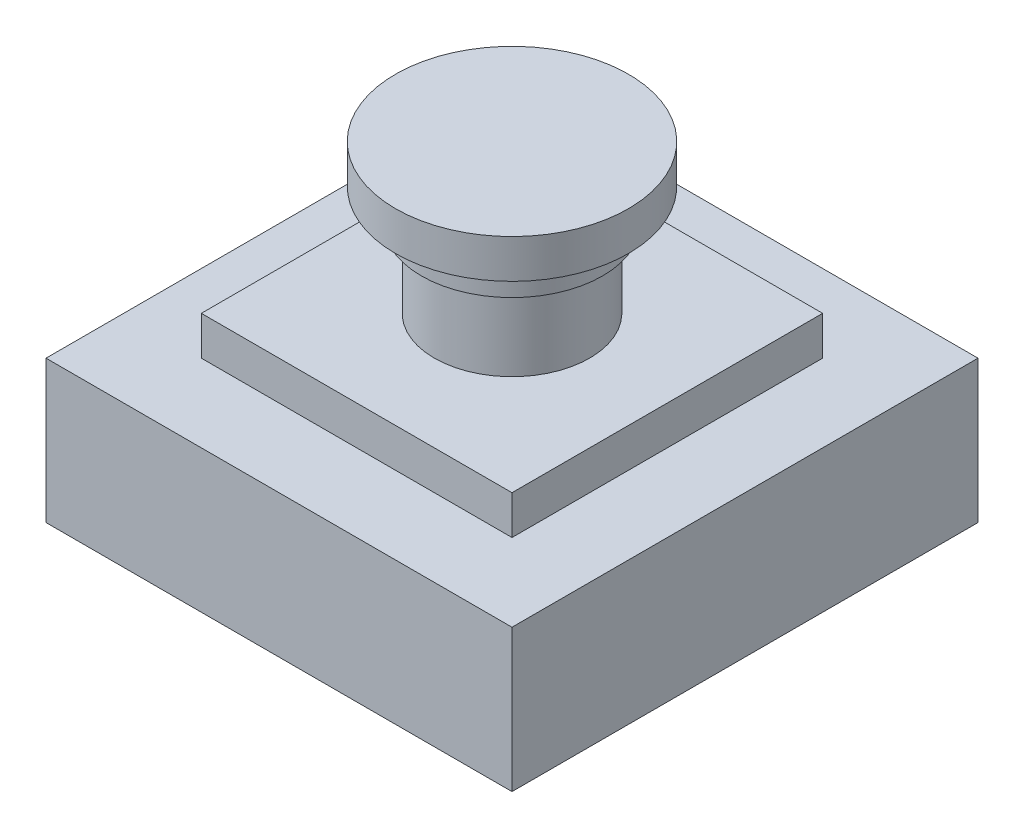
ISO-10303-21;
HEADER;
FILE_DESCRIPTION(('STEP AP214'),'2;1');
FILE_NAME('part.step','',(''),(''),'','','');
FILE_SCHEMA(('AUTOMOTIVE_DESIGN { 1 0 10303 214 1 1 1 1 }'));
ENDSEC;
DATA;
#1=APPLICATION_CONTEXT('core data for automotive mechanical design processes');
#2=APPLICATION_PROTOCOL_DEFINITION('international standard','automotive_design',2000,#1);
#3=PRODUCT_CONTEXT('',#1,'mechanical');
#4=PRODUCT('Part','Part','',(#3));
#5=PRODUCT_RELATED_PRODUCT_CATEGORY('part','',(#4));
#6=PRODUCT_DEFINITION_FORMATION('','',#4);
#7=PRODUCT_DEFINITION_CONTEXT('part definition',#1,'design');
#8=PRODUCT_DEFINITION('design','',#6,#7);
#9=PRODUCT_DEFINITION_SHAPE('','',#8);
#10=(LENGTH_UNIT() NAMED_UNIT(*) SI_UNIT(.MILLI.,.METRE.));
#11=(NAMED_UNIT(*) PLANE_ANGLE_UNIT() SI_UNIT($,.RADIAN.));
#12=(NAMED_UNIT(*) SI_UNIT($,.STERADIAN.) SOLID_ANGLE_UNIT());
#13=UNCERTAINTY_MEASURE_WITH_UNIT(LENGTH_MEASURE(1.E-05),#10,'distance_accuracy_value','');
#14=(GEOMETRIC_REPRESENTATION_CONTEXT(3) GLOBAL_UNCERTAINTY_ASSIGNED_CONTEXT((#13)) GLOBAL_UNIT_ASSIGNED_CONTEXT((#10,
#11,#12)) REPRESENTATION_CONTEXT('',''));
#15=CARTESIAN_POINT('',(0.,0.,0.));
#16=DIRECTION('',(0.,0.,1.));
#17=DIRECTION('',(1.,0.,0.));
#18=AXIS2_PLACEMENT_3D('',#15,#16,#17);
#19=CARTESIAN_POINT('',(18.,11.,-18.));
#20=DIRECTION('',(-1.,0.,0.));
#21=DIRECTION('',(0.,0.,1.));
#22=AXIS2_PLACEMENT_3D('',#19,#20,#21);
#23=PLANE('',#22);
#24=DIRECTION('',(0.,0.,-1.));
#25=VECTOR('',#24,1.);
#26=CARTESIAN_POINT('',(18.,0.,-18.));
#27=LINE('',#26,#25);
#28=CARTESIAN_POINT('',(18.,0.,18.));
#29=VERTEX_POINT('',#28);
#30=CARTESIAN_POINT('',(18.,0.,-18.));
#31=VERTEX_POINT('',#30);
#32=EDGE_CURVE('E118',#29,#31,#27,.T.);
#33=ORIENTED_EDGE('',*,*,#32,.T.);
#34=DIRECTION('',(0.,-1.,0.));
#35=VECTOR('',#34,1.);
#36=CARTESIAN_POINT('',(18.,11.,-18.));
#37=LINE('',#36,#35);
#38=CARTESIAN_POINT('',(18.,11.,-18.));
#39=VERTEX_POINT('',#38);
#40=EDGE_CURVE('E36',#39,#31,#37,.T.);
#41=ORIENTED_EDGE('',*,*,#40,.F.);
#42=DIRECTION('',(0.,0.,-1.));
#43=VECTOR('',#42,1.);
#44=CARTESIAN_POINT('',(18.,11.,-18.));
#45=LINE('',#44,#43);
#46=CARTESIAN_POINT('',(18.,11.,18.));
#47=VERTEX_POINT('',#46);
#48=EDGE_CURVE('E127',#47,#39,#45,.T.);
#49=ORIENTED_EDGE('',*,*,#48,.F.);
#50=DIRECTION('',(0.,-1.,0.));
#51=VECTOR('',#50,1.);
#52=CARTESIAN_POINT('',(18.,11.,18.));
#53=LINE('',#52,#51);
#54=EDGE_CURVE('E136',#47,#29,#53,.T.);
#55=ORIENTED_EDGE('',*,*,#54,.T.);
#56=EDGE_LOOP('',(#33,#41,#49,#55));
#57=FACE_BOUND('',#56,.T.);
#58=ADVANCED_FACE('F33',(#57),#23,.F.);
#59=CARTESIAN_POINT('',(-18.,11.,-18.));
#60=DIRECTION('',(0.,0.,1.));
#61=DIRECTION('',(1.,0.,0.));
#62=AXIS2_PLACEMENT_3D('',#59,#60,#61);
#63=PLANE('',#62);
#64=DIRECTION('',(-1.,0.,0.));
#65=VECTOR('',#64,1.);
#66=CARTESIAN_POINT('',(-18.,0.,-18.));
#67=LINE('',#66,#65);
#68=CARTESIAN_POINT('',(-18.,0.,-18.));
#69=VERTEX_POINT('',#68);
#70=EDGE_CURVE('E121',#31,#69,#67,.T.);
#71=ORIENTED_EDGE('',*,*,#70,.T.);
#72=DIRECTION('',(0.,-1.,0.));
#73=VECTOR('',#72,1.);
#74=CARTESIAN_POINT('',(-18.,11.,-18.));
#75=LINE('',#74,#73);
#76=CARTESIAN_POINT('',(-18.,11.,-18.));
#77=VERTEX_POINT('',#76);
#78=EDGE_CURVE('E146',#77,#69,#75,.T.);
#79=ORIENTED_EDGE('',*,*,#78,.F.);
#80=DIRECTION('',(-1.,0.,0.));
#81=VECTOR('',#80,1.);
#82=CARTESIAN_POINT('',(-18.,11.,-18.));
#83=LINE('',#82,#81);
#84=EDGE_CURVE('E130',#39,#77,#83,.T.);
#85=ORIENTED_EDGE('',*,*,#84,.F.);
#86=ORIENTED_EDGE('',*,*,#40,.T.);
#87=EDGE_LOOP('',(#71,#79,#85,#86));
#88=FACE_BOUND('',#87,.T.);
#89=ADVANCED_FACE('F155',(#88),#63,.F.);
#90=CARTESIAN_POINT('',(-18.,11.,-18.));
#91=DIRECTION('',(1.,0.,0.));
#92=DIRECTION('',(0.,0.,-1.));
#93=AXIS2_PLACEMENT_3D('',#90,#91,#92);
#94=PLANE('',#93);
#95=DIRECTION('',(0.,0.,1.));
#96=VECTOR('',#95,1.);
#97=CARTESIAN_POINT('',(-18.,0.,-18.));
#98=LINE('',#97,#96);
#99=CARTESIAN_POINT('',(-18.,0.,18.));
#100=VERTEX_POINT('',#99);
#101=EDGE_CURVE('E139',#69,#100,#98,.T.);
#102=ORIENTED_EDGE('',*,*,#101,.T.);
#103=DIRECTION('',(0.,-1.,0.));
#104=VECTOR('',#103,1.);
#105=CARTESIAN_POINT('',(-18.,11.,18.));
#106=LINE('',#105,#104);
#107=CARTESIAN_POINT('',(-18.,11.,18.));
#108=VERTEX_POINT('',#107);
#109=EDGE_CURVE('E144',#108,#100,#106,.T.);
#110=ORIENTED_EDGE('',*,*,#109,.F.);
#111=DIRECTION('',(0.,0.,1.));
#112=VECTOR('',#111,1.);
#113=CARTESIAN_POINT('',(-18.,11.,-18.));
#114=LINE('',#113,#112);
#115=EDGE_CURVE('E133',#77,#108,#114,.T.);
#116=ORIENTED_EDGE('',*,*,#115,.F.);
#117=ORIENTED_EDGE('',*,*,#78,.T.);
#118=EDGE_LOOP('',(#102,#110,#116,#117));
#119=FACE_BOUND('',#118,.T.);
#120=ADVANCED_FACE('F164',(#119),#94,.F.);
#121=CARTESIAN_POINT('',(-18.,11.,18.));
#122=DIRECTION('',(0.,0.,-1.));
#123=DIRECTION('',(-1.,0.,0.));
#124=AXIS2_PLACEMENT_3D('',#121,#122,#123);
#125=PLANE('',#124);
#126=DIRECTION('',(1.,0.,0.));
#127=VECTOR('',#126,1.);
#128=CARTESIAN_POINT('',(-18.,0.,18.));
#129=LINE('',#128,#127);
#130=EDGE_CURVE('E131',#100,#29,#129,.T.);
#131=ORIENTED_EDGE('',*,*,#130,.T.);
#132=ORIENTED_EDGE('',*,*,#54,.F.);
#133=DIRECTION('',(1.,0.,0.));
#134=VECTOR('',#133,1.);
#135=CARTESIAN_POINT('',(-18.,11.,18.));
#136=LINE('',#135,#134);
#137=EDGE_CURVE('E135',#108,#47,#136,.T.);
#138=ORIENTED_EDGE('',*,*,#137,.F.);
#139=ORIENTED_EDGE('',*,*,#109,.T.);
#140=EDGE_LOOP('',(#131,#132,#138,#139));
#141=FACE_BOUND('',#140,.T.);
#142=ADVANCED_FACE('F167',(#141),#125,.F.);
#143=CARTESIAN_POINT('',(0.,11.,0.));
#144=DIRECTION('',(0.,1.,0.));
#145=DIRECTION('',(0.,0.,1.));
#146=AXIS2_PLACEMENT_3D('',#143,#144,#145);
#147=PLANE('',#146);
#148=DIRECTION('',(0.,0.,-1.));
#149=VECTOR('',#148,1.);
#150=CARTESIAN_POINT('',(12.,11.,-12.));
#151=LINE('',#150,#149);
#152=CARTESIAN_POINT('',(12.,11.,12.));
#153=VERTEX_POINT('',#152);
#154=CARTESIAN_POINT('',(12.,11.,-12.));
#155=VERTEX_POINT('',#154);
#156=EDGE_CURVE('E48',#153,#155,#151,.T.);
#157=ORIENTED_EDGE('',*,*,#156,.F.);
#158=DIRECTION('',(1.,0.,0.));
#159=VECTOR('',#158,1.);
#160=CARTESIAN_POINT('',(-12.,11.,12.));
#161=LINE('',#160,#159);
#162=CARTESIAN_POINT('',(-12.,11.,12.));
#163=VERTEX_POINT('',#162);
#164=EDGE_CURVE('E52',#163,#153,#161,.T.);
#165=ORIENTED_EDGE('',*,*,#164,.F.);
#166=DIRECTION('',(0.,0.,1.));
#167=VECTOR('',#166,1.);
#168=CARTESIAN_POINT('',(-12.,11.,-12.));
#169=LINE('',#168,#167);
#170=CARTESIAN_POINT('',(-12.,11.,-12.));
#171=VERTEX_POINT('',#170);
#172=EDGE_CURVE('E337',#171,#163,#169,.T.);
#173=ORIENTED_EDGE('',*,*,#172,.F.);
#174=DIRECTION('',(-1.,0.,0.));
#175=VECTOR('',#174,1.);
#176=CARTESIAN_POINT('',(-12.,11.,-12.));
#177=LINE('',#176,#175);
#178=EDGE_CURVE('E335',#155,#171,#177,.T.);
#179=ORIENTED_EDGE('',*,*,#178,.F.);
#180=EDGE_LOOP('',(#157,#165,#173,#179));
#181=FACE_BOUND('',#180,.T.);
#182=ORIENTED_EDGE('',*,*,#48,.T.);
#183=ORIENTED_EDGE('',*,*,#84,.T.);
#184=ORIENTED_EDGE('',*,*,#115,.T.);
#185=ORIENTED_EDGE('',*,*,#137,.T.);
#186=EDGE_LOOP('',(#182,#183,#184,#185));
#187=FACE_BOUND('',#186,.T.);
#188=ADVANCED_FACE('F169',(#181,#187),#147,.T.);
#189=CARTESIAN_POINT('',(0.,0.,0.));
#190=DIRECTION('',(0.,1.,0.));
#191=DIRECTION('',(0.,0.,1.));
#192=AXIS2_PLACEMENT_3D('',#189,#190,#191);
#193=PLANE('',#192);
#194=ORIENTED_EDGE('',*,*,#32,.F.);
#195=ORIENTED_EDGE('',*,*,#130,.F.);
#196=ORIENTED_EDGE('',*,*,#101,.F.);
#197=ORIENTED_EDGE('',*,*,#70,.F.);
#198=EDGE_LOOP('',(#194,#195,#196,#197));
#199=FACE_BOUND('',#198,.T.);
#200=ADVANCED_FACE('F162',(#199),#193,.F.);
#201=CARTESIAN_POINT('',(12.,14.,-12.));
#202=DIRECTION('',(-1.,0.,0.));
#203=DIRECTION('',(0.,0.,1.));
#204=AXIS2_PLACEMENT_3D('',#201,#202,#203);
#205=PLANE('',#204);
#206=ORIENTED_EDGE('',*,*,#156,.T.);
#207=DIRECTION('',(0.,-1.,0.));
#208=VECTOR('',#207,1.);
#209=CARTESIAN_POINT('',(12.,14.,-12.));
#210=LINE('',#209,#208);
#211=CARTESIAN_POINT('',(12.,14.,-12.));
#212=VERTEX_POINT('',#211);
#213=EDGE_CURVE('E101',#212,#155,#210,.T.);
#214=ORIENTED_EDGE('',*,*,#213,.F.);
#215=DIRECTION('',(0.,0.,-1.));
#216=VECTOR('',#215,1.);
#217=CARTESIAN_POINT('',(12.,14.,-12.));
#218=LINE('',#217,#216);
#219=CARTESIAN_POINT('',(12.,14.,12.));
#220=VERTEX_POINT('',#219);
#221=EDGE_CURVE('E107',#220,#212,#218,.T.);
#222=ORIENTED_EDGE('',*,*,#221,.F.);
#223=DIRECTION('',(0.,-1.,0.));
#224=VECTOR('',#223,1.);
#225=CARTESIAN_POINT('',(12.,14.,12.));
#226=LINE('',#225,#224);
#227=EDGE_CURVE('E333',#220,#153,#226,.T.);
#228=ORIENTED_EDGE('',*,*,#227,.T.);
#229=EDGE_LOOP('',(#206,#214,#222,#228));
#230=FACE_BOUND('',#229,.T.);
#231=ADVANCED_FACE('F117',(#230),#205,.F.);
#232=CARTESIAN_POINT('',(-12.,14.,-12.));
#233=DIRECTION('',(0.,0.,1.));
#234=DIRECTION('',(1.,0.,0.));
#235=AXIS2_PLACEMENT_3D('',#232,#233,#234);
#236=PLANE('',#235);
#237=ORIENTED_EDGE('',*,*,#178,.T.);
#238=DIRECTION('',(0.,-1.,0.));
#239=VECTOR('',#238,1.);
#240=CARTESIAN_POINT('',(-12.,14.,-12.));
#241=LINE('',#240,#239);
#242=CARTESIAN_POINT('',(-12.,14.,-12.));
#243=VERTEX_POINT('',#242);
#244=EDGE_CURVE('E103',#243,#171,#241,.T.);
#245=ORIENTED_EDGE('',*,*,#244,.F.);
#246=DIRECTION('',(-1.,0.,0.));
#247=VECTOR('',#246,1.);
#248=CARTESIAN_POINT('',(-12.,14.,-12.));
#249=LINE('',#248,#247);
#250=EDGE_CURVE('E96',#212,#243,#249,.T.);
#251=ORIENTED_EDGE('',*,*,#250,.F.);
#252=ORIENTED_EDGE('',*,*,#213,.T.);
#253=EDGE_LOOP('',(#237,#245,#251,#252));
#254=FACE_BOUND('',#253,.T.);
#255=ADVANCED_FACE('F99',(#254),#236,.F.);
#256=CARTESIAN_POINT('',(-12.,14.,-12.));
#257=DIRECTION('',(1.,0.,0.));
#258=DIRECTION('',(0.,0.,-1.));
#259=AXIS2_PLACEMENT_3D('',#256,#257,#258);
#260=PLANE('',#259);
#261=ORIENTED_EDGE('',*,*,#172,.T.);
#262=DIRECTION('',(0.,-1.,0.));
#263=VECTOR('',#262,1.);
#264=CARTESIAN_POINT('',(-12.,14.,12.));
#265=LINE('',#264,#263);
#266=CARTESIAN_POINT('',(-12.,14.,12.));
#267=VERTEX_POINT('',#266);
#268=EDGE_CURVE('E123',#267,#163,#265,.T.);
#269=ORIENTED_EDGE('',*,*,#268,.F.);
#270=DIRECTION('',(0.,0.,1.));
#271=VECTOR('',#270,1.);
#272=CARTESIAN_POINT('',(-12.,14.,-12.));
#273=LINE('',#272,#271);
#274=EDGE_CURVE('E106',#243,#267,#273,.T.);
#275=ORIENTED_EDGE('',*,*,#274,.F.);
#276=ORIENTED_EDGE('',*,*,#244,.T.);
#277=EDGE_LOOP('',(#261,#269,#275,#276));
#278=FACE_BOUND('',#277,.T.);
#279=ADVANCED_FACE('F219',(#278),#260,.F.);
#280=CARTESIAN_POINT('',(-12.,14.,12.));
#281=DIRECTION('',(0.,0.,-1.));
#282=DIRECTION('',(-1.,0.,0.));
#283=AXIS2_PLACEMENT_3D('',#280,#281,#282);
#284=PLANE('',#283);
#285=ORIENTED_EDGE('',*,*,#164,.T.);
#286=ORIENTED_EDGE('',*,*,#227,.F.);
#287=DIRECTION('',(1.,0.,0.));
#288=VECTOR('',#287,1.);
#289=CARTESIAN_POINT('',(-12.,14.,12.));
#290=LINE('',#289,#288);
#291=EDGE_CURVE('E112',#267,#220,#290,.T.);
#292=ORIENTED_EDGE('',*,*,#291,.F.);
#293=ORIENTED_EDGE('',*,*,#268,.T.);
#294=EDGE_LOOP('',(#285,#286,#292,#293));
#295=FACE_BOUND('',#294,.T.);
#296=ADVANCED_FACE('F228',(#295),#284,.F.);
#297=CARTESIAN_POINT('',(0.,14.,0.));
#298=DIRECTION('',(0.,1.,0.));
#299=DIRECTION('',(0.,0.,1.));
#300=AXIS2_PLACEMENT_3D('',#297,#298,#299);
#301=PLANE('',#300);
#302=CARTESIAN_POINT('',(0.,14.,0.));
#303=DIRECTION('',(0.,1.,0.));
#304=DIRECTION('',(0.,0.,1.));
#305=AXIS2_PLACEMENT_3D('',#302,#303,#304);
#306=CIRCLE('',#305,6.);
#307=CARTESIAN_POINT('',(0.,14.,6.));
#308=VERTEX_POINT('',#307);
#309=EDGE_CURVE('E11',#308,#308,#306,.T.);
#310=ORIENTED_EDGE('',*,*,#309,.F.);
#311=EDGE_LOOP('',(#310));
#312=FACE_BOUND('',#311,.T.);
#313=ORIENTED_EDGE('',*,*,#221,.T.);
#314=ORIENTED_EDGE('',*,*,#250,.T.);
#315=ORIENTED_EDGE('',*,*,#274,.T.);
#316=ORIENTED_EDGE('',*,*,#291,.T.);
#317=EDGE_LOOP('',(#313,#314,#315,#316));
#318=FACE_BOUND('',#317,.T.);
#319=ADVANCED_FACE('F110',(#312,#318),#301,.T.);
#320=CARTESIAN_POINT('',(0.,20.,0.));
#321=DIRECTION('',(0.,-1.,0.));
#322=DIRECTION('',(0.,0.,-1.));
#323=AXIS2_PLACEMENT_3D('',#320,#321,#322);
#324=CYLINDRICAL_SURFACE('',#323,6.);
#325=CARTESIAN_POINT('',(0.,20.,0.));
#326=DIRECTION('',(0.,1.,0.));
#327=DIRECTION('',(0.,0.,1.));
#328=AXIS2_PLACEMENT_3D('',#325,#326,#327);
#329=CIRCLE('',#328,6.);
#330=CARTESIAN_POINT('',(0.,20.,6.));
#331=VERTEX_POINT('',#330);
#332=EDGE_CURVE('E326',#331,#331,#329,.T.);
#333=ORIENTED_EDGE('',*,*,#332,.F.);
#334=EDGE_LOOP('',(#333));
#335=FACE_BOUND('',#334,.T.);
#336=ORIENTED_EDGE('',*,*,#309,.T.);
#337=EDGE_LOOP('',(#336));
#338=FACE_BOUND('',#337,.T.);
#339=ADVANCED_FACE('F247',(#335,#338),#324,.T.);
#340=CARTESIAN_POINT('',(0.,22.5,0.));
#341=DIRECTION('',(0.,-1.,0.));
#342=DIRECTION('',(0.,0.,-1.));
#343=AXIS2_PLACEMENT_3D('',#340,#341,#342);
#344=CYLINDRICAL_SURFACE('',#343,7.);
#345=CARTESIAN_POINT('',(0.,22.5,0.));
#346=DIRECTION('',(0.,1.,0.));
#347=DIRECTION('',(0.,0.,1.));
#348=AXIS2_PLACEMENT_3D('',#345,#346,#347);
#349=CIRCLE('',#348,7.);
#350=CARTESIAN_POINT('',(0.,22.5,7.));
#351=VERTEX_POINT('',#350);
#352=EDGE_CURVE('E314',#351,#351,#349,.T.);
#353=ORIENTED_EDGE('',*,*,#352,.F.);
#354=EDGE_LOOP('',(#353));
#355=FACE_BOUND('',#354,.T.);
#356=CARTESIAN_POINT('',(0.,20.,0.));
#357=DIRECTION('',(0.,1.,0.));
#358=DIRECTION('',(0.,0.,1.));
#359=AXIS2_PLACEMENT_3D('',#356,#357,#358);
#360=CIRCLE('',#359,7.);
#361=CARTESIAN_POINT('',(0.,20.,7.));
#362=VERTEX_POINT('',#361);
#363=EDGE_CURVE('E322',#362,#362,#360,.T.);
#364=ORIENTED_EDGE('',*,*,#363,.T.);
#365=EDGE_LOOP('',(#364));
#366=FACE_BOUND('',#365,.T.);
#367=ADVANCED_FACE('F257',(#355,#366),#344,.T.);
#368=CARTESIAN_POINT('',(0.,20.,0.));
#369=DIRECTION('',(0.,1.,0.));
#370=DIRECTION('',(0.,0.,1.));
#371=AXIS2_PLACEMENT_3D('',#368,#369,#370);
#372=PLANE('',#371);
#373=ORIENTED_EDGE('',*,*,#332,.T.);
#374=EDGE_LOOP('',(#373));
#375=FACE_BOUND('',#374,.T.);
#376=ORIENTED_EDGE('',*,*,#363,.F.);
#377=EDGE_LOOP('',(#376));
#378=FACE_BOUND('',#377,.T.);
#379=ADVANCED_FACE('F267',(#375,#378),#372,.F.);
#380=CARTESIAN_POINT('',(0.,25.5,0.));
#381=DIRECTION('',(0.,-1.,0.));
#382=DIRECTION('',(0.,0.,-1.));
#383=AXIS2_PLACEMENT_3D('',#380,#381,#382);
#384=CYLINDRICAL_SURFACE('',#383,9.);
#385=CARTESIAN_POINT('',(0.,25.5,0.));
#386=DIRECTION('',(0.,1.,0.));
#387=DIRECTION('',(0.,0.,1.));
#388=AXIS2_PLACEMENT_3D('',#385,#386,#387);
#389=CIRCLE('',#388,9.);
#390=CARTESIAN_POINT('',(0.,25.5,9.));
#391=VERTEX_POINT('',#390);
#392=EDGE_CURVE('E319',#391,#391,#389,.T.);
#393=ORIENTED_EDGE('',*,*,#392,.F.);
#394=EDGE_LOOP('',(#393));
#395=FACE_BOUND('',#394,.T.);
#396=CARTESIAN_POINT('',(0.,22.5,0.));
#397=DIRECTION('',(0.,1.,0.));
#398=DIRECTION('',(0.,0.,1.));
#399=AXIS2_PLACEMENT_3D('',#396,#397,#398);
#400=CIRCLE('',#399,9.);
#401=CARTESIAN_POINT('',(0.,22.5,9.));
#402=VERTEX_POINT('',#401);
#403=EDGE_CURVE('E317',#402,#402,#400,.T.);
#404=ORIENTED_EDGE('',*,*,#403,.T.);
#405=EDGE_LOOP('',(#404));
#406=FACE_BOUND('',#405,.T.);
#407=ADVANCED_FACE('F277',(#395,#406),#384,.T.);
#408=CARTESIAN_POINT('',(0.,25.5,0.));
#409=DIRECTION('',(0.,1.,0.));
#410=DIRECTION('',(0.,0.,1.));
#411=AXIS2_PLACEMENT_3D('',#408,#409,#410);
#412=PLANE('',#411);
#413=ORIENTED_EDGE('',*,*,#392,.T.);
#414=EDGE_LOOP('',(#413));
#415=FACE_BOUND('',#414,.T.);
#416=ADVANCED_FACE('F287',(#415),#412,.T.);
#417=CARTESIAN_POINT('',(0.,22.5,0.));
#418=DIRECTION('',(0.,1.,0.));
#419=DIRECTION('',(0.,0.,1.));
#420=AXIS2_PLACEMENT_3D('',#417,#418,#419);
#421=PLANE('',#420);
#422=ORIENTED_EDGE('',*,*,#352,.T.);
#423=EDGE_LOOP('',(#422));
#424=FACE_BOUND('',#423,.T.);
#425=ORIENTED_EDGE('',*,*,#403,.F.);
#426=EDGE_LOOP('',(#425));
#427=FACE_BOUND('',#426,.T.);
#428=ADVANCED_FACE('F297',(#424,#427),#421,.F.);
#429=CLOSED_SHELL('',(#58,#89,#120,#142,#188,#200,#231,#255,#279,#296,#319,#339,#367,#379,#407,
#416,#428));
#430=MANIFOLD_SOLID_BREP('B2',#429);
#431=ADVANCED_BREP_SHAPE_REPRESENTATION('',(#18,#430),#14);
#432=SHAPE_DEFINITION_REPRESENTATION(#9,#431);
ENDSEC;
END-ISO-10303-21;
